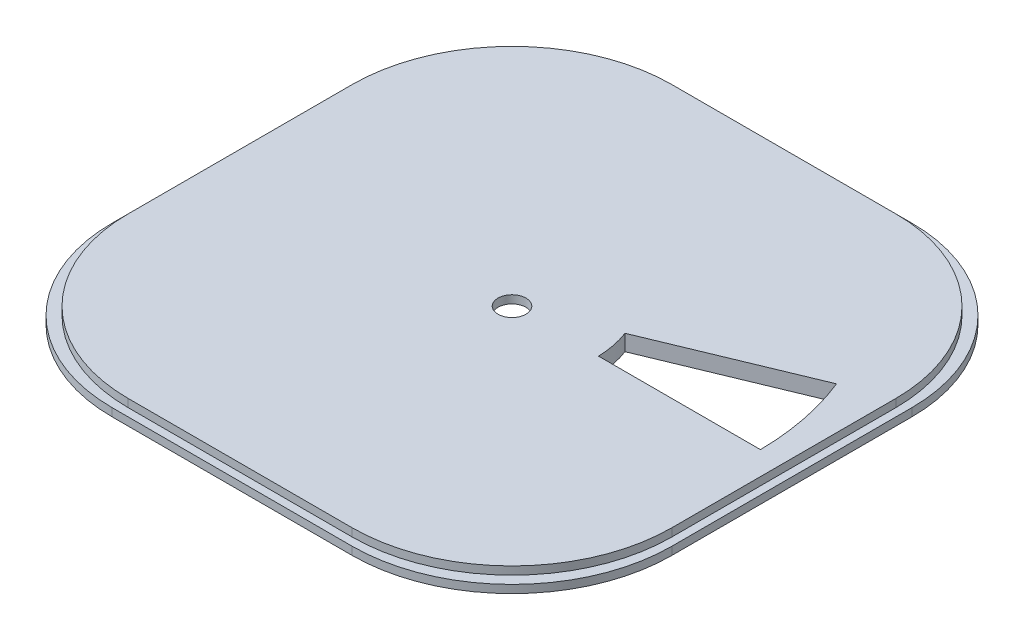
ISO-10303-21;
HEADER;
FILE_DESCRIPTION(('STEP AP214'),'2;1');
FILE_NAME('part.step','',(''),(''),'','','');
FILE_SCHEMA(('AUTOMOTIVE_DESIGN { 1 0 10303 214 1 1 1 1 }'));
ENDSEC;
DATA;
#1=APPLICATION_CONTEXT('core data for automotive mechanical design processes');
#2=APPLICATION_PROTOCOL_DEFINITION('international standard','automotive_design',2000,#1);
#3=PRODUCT_CONTEXT('',#1,'mechanical');
#4=PRODUCT('Part','Part','',(#3));
#5=PRODUCT_RELATED_PRODUCT_CATEGORY('part','',(#4));
#6=PRODUCT_DEFINITION_FORMATION('','',#4);
#7=PRODUCT_DEFINITION_CONTEXT('part definition',#1,'design');
#8=PRODUCT_DEFINITION('design','',#6,#7);
#9=PRODUCT_DEFINITION_SHAPE('','',#8);
#10=(LENGTH_UNIT() NAMED_UNIT(*) SI_UNIT(.MILLI.,.METRE.));
#11=(NAMED_UNIT(*) PLANE_ANGLE_UNIT() SI_UNIT($,.RADIAN.));
#12=(NAMED_UNIT(*) SI_UNIT($,.STERADIAN.) SOLID_ANGLE_UNIT());
#13=UNCERTAINTY_MEASURE_WITH_UNIT(LENGTH_MEASURE(1.E-05),#10,'distance_accuracy_value','');
#14=(GEOMETRIC_REPRESENTATION_CONTEXT(3) GLOBAL_UNCERTAINTY_ASSIGNED_CONTEXT((#13)) GLOBAL_UNIT_ASSIGNED_CONTEXT((#10,
#11,#12)) REPRESENTATION_CONTEXT('',''));
#15=CARTESIAN_POINT('',(0.,0.,0.));
#16=DIRECTION('',(0.,0.,1.));
#17=DIRECTION('',(1.,0.,0.));
#18=AXIS2_PLACEMENT_3D('',#15,#16,#17);
#19=CARTESIAN_POINT('',(-30.,0.,30.));
#20=DIRECTION('',(0.,-1.,0.));
#21=DIRECTION('',(0.,0.,-1.));
#22=AXIS2_PLACEMENT_3D('',#19,#20,#21);
#23=PLANE('',#22);
#24=DIRECTION('',(0.,0.,1.));
#25=VECTOR('',#24,1.);
#26=CARTESIAN_POINT('',(-70.,0.,-29.9999999999997));
#27=LINE('',#26,#25);
#28=CARTESIAN_POINT('',(-70.,0.,-29.9999999999997));
#29=VERTEX_POINT('',#28);
#30=CARTESIAN_POINT('',(-70.,0.,29.9999999999997));
#31=VERTEX_POINT('',#30);
#32=EDGE_CURVE('E323',#29,#31,#27,.T.);
#33=ORIENTED_EDGE('',*,*,#32,.T.);
#34=CARTESIAN_POINT('',(-30.,0.,30.));
#35=DIRECTION('',(0.,-1.,0.));
#36=DIRECTION('',(0.,0.,-1.));
#37=AXIS2_PLACEMENT_3D('',#34,#35,#36);
#38=CIRCLE('',#37,40.);
#39=CARTESIAN_POINT('',(-29.9999999999997,0.,70.));
#40=VERTEX_POINT('',#39);
#41=EDGE_CURVE('E346',#40,#31,#38,.T.);
#42=ORIENTED_EDGE('',*,*,#41,.F.);
#43=DIRECTION('',(1.,0.,0.));
#44=VECTOR('',#43,1.);
#45=CARTESIAN_POINT('',(-29.9999999999997,0.,70.));
#46=LINE('',#45,#44);
#47=CARTESIAN_POINT('',(29.9999999999997,0.,70.));
#48=VERTEX_POINT('',#47);
#49=EDGE_CURVE('E349',#40,#48,#46,.T.);
#50=ORIENTED_EDGE('',*,*,#49,.T.);
#51=CARTESIAN_POINT('',(30.,0.,30.));
#52=DIRECTION('',(0.,1.,0.));
#53=DIRECTION('',(0.,0.,1.));
#54=AXIS2_PLACEMENT_3D('',#51,#52,#53);
#55=CIRCLE('',#54,40.);
#56=CARTESIAN_POINT('',(70.,0.,29.9999999999997));
#57=VERTEX_POINT('',#56);
#58=EDGE_CURVE('E352',#48,#57,#55,.T.);
#59=ORIENTED_EDGE('',*,*,#58,.T.);
#60=DIRECTION('',(0.,0.,1.));
#61=VECTOR('',#60,1.);
#62=CARTESIAN_POINT('',(70.,0.,-29.9999999999997));
#63=LINE('',#62,#61);
#64=CARTESIAN_POINT('',(70.,0.,-29.9999999999997));
#65=VERTEX_POINT('',#64);
#66=EDGE_CURVE('E355',#65,#57,#63,.T.);
#67=ORIENTED_EDGE('',*,*,#66,.F.);
#68=CARTESIAN_POINT('',(30.,0.,-30.));
#69=DIRECTION('',(0.,1.,0.));
#70=DIRECTION('',(0.,0.,1.));
#71=AXIS2_PLACEMENT_3D('',#68,#69,#70);
#72=CIRCLE('',#71,40.);
#73=CARTESIAN_POINT('',(29.9999999999997,0.,-70.));
#74=VERTEX_POINT('',#73);
#75=EDGE_CURVE('E358',#65,#74,#72,.T.);
#76=ORIENTED_EDGE('',*,*,#75,.T.);
#77=DIRECTION('',(1.,0.,0.));
#78=VECTOR('',#77,1.);
#79=CARTESIAN_POINT('',(-29.9999999999997,0.,-70.));
#80=LINE('',#79,#78);
#81=CARTESIAN_POINT('',(-30.,0.,-70.));
#82=VERTEX_POINT('',#81);
#83=EDGE_CURVE('E361',#82,#74,#80,.T.);
#84=ORIENTED_EDGE('',*,*,#83,.F.);
#85=CARTESIAN_POINT('',(-30.,0.,-30.));
#86=DIRECTION('',(0.,-1.,0.));
#87=DIRECTION('',(0.,0.,-1.));
#88=AXIS2_PLACEMENT_3D('',#85,#86,#87);
#89=CIRCLE('',#88,40.);
#90=EDGE_CURVE('E364',#29,#82,#89,.T.);
#91=ORIENTED_EDGE('',*,*,#90,.F.);
#92=EDGE_LOOP('',(#33,#42,#50,#59,#67,#76,#84,#91));
#93=FACE_BOUND('',#92,.T.);
#94=CARTESIAN_POINT('',(-28.,0.,28.));
#95=DIRECTION('',(0.,1.,0.));
#96=DIRECTION('',(0.,0.,1.));
#97=AXIS2_PLACEMENT_3D('',#94,#95,#96);
#98=CIRCLE('',#97,40.);
#99=CARTESIAN_POINT('',(-68.,0.,27.9999999999997));
#100=VERTEX_POINT('',#99);
#101=CARTESIAN_POINT('',(-27.9999999999997,0.,68.));
#102=VERTEX_POINT('',#101);
#103=EDGE_CURVE('E256',#100,#102,#98,.T.);
#104=ORIENTED_EDGE('',*,*,#103,.F.);
#105=DIRECTION('',(0.,0.,1.));
#106=VECTOR('',#105,1.);
#107=CARTESIAN_POINT('',(-68.,0.,-27.9999999999997));
#108=LINE('',#107,#106);
#109=CARTESIAN_POINT('',(-68.,0.,-27.9999999999997));
#110=VERTEX_POINT('',#109);
#111=EDGE_CURVE('E263',#110,#100,#108,.T.);
#112=ORIENTED_EDGE('',*,*,#111,.F.);
#113=CARTESIAN_POINT('',(-28.,0.,-28.));
#114=DIRECTION('',(0.,1.,0.));
#115=DIRECTION('',(0.,0.,-1.));
#116=AXIS2_PLACEMENT_3D('',#113,#114,#115);
#117=CIRCLE('',#116,40.);
#118=CARTESIAN_POINT('',(-28.,0.,-68.));
#119=VERTEX_POINT('',#118);
#120=EDGE_CURVE('E295',#119,#110,#117,.T.);
#121=ORIENTED_EDGE('',*,*,#120,.F.);
#122=DIRECTION('',(-1.,0.,0.));
#123=VECTOR('',#122,1.);
#124=CARTESIAN_POINT('',(-27.9999999999997,0.,-68.));
#125=LINE('',#124,#123);
#126=CARTESIAN_POINT('',(27.9999999999997,0.,-68.));
#127=VERTEX_POINT('',#126);
#128=EDGE_CURVE('E292',#127,#119,#125,.T.);
#129=ORIENTED_EDGE('',*,*,#128,.F.);
#130=CARTESIAN_POINT('',(28.,0.,-28.));
#131=DIRECTION('',(0.,1.,0.));
#132=DIRECTION('',(0.,0.,1.));
#133=AXIS2_PLACEMENT_3D('',#130,#131,#132);
#134=CIRCLE('',#133,40.);
#135=CARTESIAN_POINT('',(68.,0.,-27.9999999999997));
#136=VERTEX_POINT('',#135);
#137=EDGE_CURVE('E289',#136,#127,#134,.T.);
#138=ORIENTED_EDGE('',*,*,#137,.F.);
#139=DIRECTION('',(0.,0.,-1.));
#140=VECTOR('',#139,1.);
#141=CARTESIAN_POINT('',(68.,0.,-27.9999999999997));
#142=LINE('',#141,#140);
#143=CARTESIAN_POINT('',(68.,0.,27.9999999999997));
#144=VERTEX_POINT('',#143);
#145=EDGE_CURVE('E286',#144,#136,#142,.T.);
#146=ORIENTED_EDGE('',*,*,#145,.F.);
#147=CARTESIAN_POINT('',(28.,0.,28.));
#148=DIRECTION('',(0.,1.,0.));
#149=DIRECTION('',(0.,0.,1.));
#150=AXIS2_PLACEMENT_3D('',#147,#148,#149);
#151=CIRCLE('',#150,40.);
#152=CARTESIAN_POINT('',(27.9999999999997,0.,68.));
#153=VERTEX_POINT('',#152);
#154=EDGE_CURVE('E283',#153,#144,#151,.T.);
#155=ORIENTED_EDGE('',*,*,#154,.F.);
#156=DIRECTION('',(1.,0.,0.));
#157=VECTOR('',#156,1.);
#158=CARTESIAN_POINT('',(-27.9999999999997,0.,68.));
#159=LINE('',#158,#157);
#160=EDGE_CURVE('E280',#102,#153,#159,.T.);
#161=ORIENTED_EDGE('',*,*,#160,.F.);
#162=EDGE_LOOP('',(#104,#112,#121,#129,#138,#146,#155,#161));
#163=FACE_BOUND('',#162,.T.);
#164=ADVANCED_FACE('F33',(#93,#163),#23,.F.);
#165=CARTESIAN_POINT('',(-70.,-2.,-29.9999999999997));
#166=DIRECTION('',(-1.,0.,0.));
#167=DIRECTION('',(0.,0.,1.));
#168=AXIS2_PLACEMENT_3D('',#165,#166,#167);
#169=PLANE('',#168);
#170=DIRECTION('',(0.,-1.,0.));
#171=VECTOR('',#170,1.);
#172=CARTESIAN_POINT('',(-70.,-0.999999999999986,3.99999999999999));
#173=LINE('',#172,#171);
#174=CARTESIAN_POINT('',(-70.,-0.999999999999986,3.99999999999999));
#175=VERTEX_POINT('',#174);
#176=CARTESIAN_POINT('',(-70.,-2.,3.99999999999999));
#177=VERTEX_POINT('',#176);
#178=EDGE_CURVE('E236',#175,#177,#173,.T.);
#179=ORIENTED_EDGE('',*,*,#178,.T.);
#180=DIRECTION('',(0.,0.,1.));
#181=VECTOR('',#180,1.);
#182=CARTESIAN_POINT('',(-70.,-2.,-29.9999999999997));
#183=LINE('',#182,#181);
#184=CARTESIAN_POINT('',(-70.,-2.,29.9999999999997));
#185=VERTEX_POINT('',#184);
#186=EDGE_CURVE('E326',#177,#185,#183,.T.);
#187=ORIENTED_EDGE('',*,*,#186,.T.);
#188=DIRECTION('',(0.,1.,0.));
#189=VECTOR('',#188,1.);
#190=CARTESIAN_POINT('',(-70.,-2.,29.9999999999997));
#191=LINE('',#190,#189);
#192=EDGE_CURVE('E37',#185,#31,#191,.T.);
#193=ORIENTED_EDGE('',*,*,#192,.T.);
#194=ORIENTED_EDGE('',*,*,#32,.F.);
#195=DIRECTION('',(0.,1.,0.));
#196=VECTOR('',#195,1.);
#197=CARTESIAN_POINT('',(-70.,-2.,-29.9999999999997));
#198=LINE('',#197,#196);
#199=CARTESIAN_POINT('',(-70.,-2.,-29.9999999999997));
#200=VERTEX_POINT('',#199);
#201=EDGE_CURVE('E11',#200,#29,#198,.T.);
#202=ORIENTED_EDGE('',*,*,#201,.F.);
#203=CARTESIAN_POINT('',(-70.,-2.,-4.00000000000001));
#204=VERTEX_POINT('',#203);
#205=EDGE_CURVE('E214',#200,#204,#183,.T.);
#206=ORIENTED_EDGE('',*,*,#205,.T.);
#207=DIRECTION('',(0.,-1.,0.));
#208=VECTOR('',#207,1.);
#209=CARTESIAN_POINT('',(-70.,-0.999999999999986,-4.00000000000001));
#210=LINE('',#209,#208);
#211=CARTESIAN_POINT('',(-70.,-0.999999999999986,-4.00000000000001));
#212=VERTEX_POINT('',#211);
#213=EDGE_CURVE('E196',#212,#204,#210,.T.);
#214=ORIENTED_EDGE('',*,*,#213,.F.);
#215=DIRECTION('',(0.,0.,-1.));
#216=VECTOR('',#215,1.);
#217=CARTESIAN_POINT('',(-70.,-0.999999999999986,0.));
#218=LINE('',#217,#216);
#219=EDGE_CURVE('E202',#175,#212,#218,.T.);
#220=ORIENTED_EDGE('',*,*,#219,.F.);
#221=EDGE_LOOP('',(#179,#187,#193,#194,#202,#206,#214,#220));
#222=FACE_BOUND('',#221,.T.);
#223=ADVANCED_FACE('F35',(#222),#169,.T.);
#224=CARTESIAN_POINT('',(-30.,-2.,-30.));
#225=DIRECTION('',(0.,1.,0.));
#226=DIRECTION('',(0.,0.,1.));
#227=AXIS2_PLACEMENT_3D('',#224,#225,#226);
#228=CYLINDRICAL_SURFACE('',#227,40.);
#229=ORIENTED_EDGE('',*,*,#90,.T.);
#230=DIRECTION('',(0.,1.,0.));
#231=VECTOR('',#230,1.);
#232=CARTESIAN_POINT('',(-30.,-2.,-70.));
#233=LINE('',#232,#231);
#234=CARTESIAN_POINT('',(-30.,-2.,-70.));
#235=VERTEX_POINT('',#234);
#236=EDGE_CURVE('E42',#235,#82,#233,.T.);
#237=ORIENTED_EDGE('',*,*,#236,.F.);
#238=CARTESIAN_POINT('',(-30.,-2.,-30.));
#239=DIRECTION('',(0.,-1.,0.));
#240=DIRECTION('',(0.,0.,-1.));
#241=AXIS2_PLACEMENT_3D('',#238,#239,#240);
#242=CIRCLE('',#241,40.);
#243=EDGE_CURVE('E342',#200,#235,#242,.T.);
#244=ORIENTED_EDGE('',*,*,#243,.F.);
#245=ORIENTED_EDGE('',*,*,#201,.T.);
#246=EDGE_LOOP('',(#229,#237,#244,#245));
#247=FACE_BOUND('',#246,.T.);
#248=ADVANCED_FACE('F390',(#247),#228,.T.);
#249=CARTESIAN_POINT('',(-29.9999999999997,-2.,-70.));
#250=DIRECTION('',(0.,0.,1.));
#251=DIRECTION('',(1.,0.,0.));
#252=AXIS2_PLACEMENT_3D('',#249,#250,#251);
#253=PLANE('',#252);
#254=ORIENTED_EDGE('',*,*,#83,.T.);
#255=DIRECTION('',(0.,1.,0.));
#256=VECTOR('',#255,1.);
#257=CARTESIAN_POINT('',(29.9999999999997,-2.,-70.));
#258=LINE('',#257,#256);
#259=CARTESIAN_POINT('',(29.9999999999997,-2.,-70.));
#260=VERTEX_POINT('',#259);
#261=EDGE_CURVE('E368',#260,#74,#258,.T.);
#262=ORIENTED_EDGE('',*,*,#261,.F.);
#263=DIRECTION('',(1.,0.,0.));
#264=VECTOR('',#263,1.);
#265=CARTESIAN_POINT('',(-29.9999999999997,-2.,-70.));
#266=LINE('',#265,#264);
#267=EDGE_CURVE('E340',#235,#260,#266,.T.);
#268=ORIENTED_EDGE('',*,*,#267,.F.);
#269=ORIENTED_EDGE('',*,*,#236,.T.);
#270=EDGE_LOOP('',(#254,#262,#268,#269));
#271=FACE_BOUND('',#270,.T.);
#272=ADVANCED_FACE('F394',(#271),#253,.F.);
#273=CARTESIAN_POINT('',(30.,-2.,-30.));
#274=DIRECTION('',(0.,1.,0.));
#275=DIRECTION('',(0.,0.,1.));
#276=AXIS2_PLACEMENT_3D('',#273,#274,#275);
#277=CYLINDRICAL_SURFACE('',#276,40.);
#278=ORIENTED_EDGE('',*,*,#75,.F.);
#279=DIRECTION('',(0.,1.,0.));
#280=VECTOR('',#279,1.);
#281=CARTESIAN_POINT('',(70.,-2.,-29.9999999999997));
#282=LINE('',#281,#280);
#283=CARTESIAN_POINT('',(70.,-2.,-29.9999999999997));
#284=VERTEX_POINT('',#283);
#285=EDGE_CURVE('E370',#284,#65,#282,.T.);
#286=ORIENTED_EDGE('',*,*,#285,.F.);
#287=CARTESIAN_POINT('',(30.,-2.,-30.));
#288=DIRECTION('',(0.,1.,0.));
#289=DIRECTION('',(0.,0.,1.));
#290=AXIS2_PLACEMENT_3D('',#287,#288,#289);
#291=CIRCLE('',#290,40.);
#292=EDGE_CURVE('E337',#284,#260,#291,.T.);
#293=ORIENTED_EDGE('',*,*,#292,.T.);
#294=ORIENTED_EDGE('',*,*,#261,.T.);
#295=EDGE_LOOP('',(#278,#286,#293,#294));
#296=FACE_BOUND('',#295,.T.);
#297=ADVANCED_FACE('F453',(#296),#277,.T.);
#298=CARTESIAN_POINT('',(70.,-2.,-29.9999999999997));
#299=DIRECTION('',(-1.,0.,0.));
#300=DIRECTION('',(0.,0.,1.));
#301=AXIS2_PLACEMENT_3D('',#298,#299,#300);
#302=PLANE('',#301);
#303=ORIENTED_EDGE('',*,*,#66,.T.);
#304=DIRECTION('',(0.,1.,0.));
#305=VECTOR('',#304,1.);
#306=CARTESIAN_POINT('',(70.,-2.,29.9999999999997));
#307=LINE('',#306,#305);
#308=CARTESIAN_POINT('',(70.,-2.,29.9999999999997));
#309=VERTEX_POINT('',#308);
#310=EDGE_CURVE('E372',#309,#57,#307,.T.);
#311=ORIENTED_EDGE('',*,*,#310,.F.);
#312=DIRECTION('',(0.,0.,1.));
#313=VECTOR('',#312,1.);
#314=CARTESIAN_POINT('',(70.,-2.,-29.9999999999997));
#315=LINE('',#314,#313);
#316=EDGE_CURVE('E335',#284,#309,#315,.T.);
#317=ORIENTED_EDGE('',*,*,#316,.F.);
#318=ORIENTED_EDGE('',*,*,#285,.T.);
#319=EDGE_LOOP('',(#303,#311,#317,#318));
#320=FACE_BOUND('',#319,.T.);
#321=ADVANCED_FACE('F456',(#320),#302,.F.);
#322=CARTESIAN_POINT('',(30.,-2.,30.));
#323=DIRECTION('',(0.,1.,0.));
#324=DIRECTION('',(0.,0.,1.));
#325=AXIS2_PLACEMENT_3D('',#322,#323,#324);
#326=CYLINDRICAL_SURFACE('',#325,40.);
#327=ORIENTED_EDGE('',*,*,#58,.F.);
#328=DIRECTION('',(0.,1.,0.));
#329=VECTOR('',#328,1.);
#330=CARTESIAN_POINT('',(29.9999999999997,-2.,70.));
#331=LINE('',#330,#329);
#332=CARTESIAN_POINT('',(29.9999999999997,-2.,70.));
#333=VERTEX_POINT('',#332);
#334=EDGE_CURVE('E374',#333,#48,#331,.T.);
#335=ORIENTED_EDGE('',*,*,#334,.F.);
#336=CARTESIAN_POINT('',(30.,-2.,30.));
#337=DIRECTION('',(0.,1.,0.));
#338=DIRECTION('',(0.,0.,1.));
#339=AXIS2_PLACEMENT_3D('',#336,#337,#338);
#340=CIRCLE('',#339,40.);
#341=EDGE_CURVE('E332',#333,#309,#340,.T.);
#342=ORIENTED_EDGE('',*,*,#341,.T.);
#343=ORIENTED_EDGE('',*,*,#310,.T.);
#344=EDGE_LOOP('',(#327,#335,#342,#343));
#345=FACE_BOUND('',#344,.T.);
#346=ADVANCED_FACE('F460',(#345),#326,.T.);
#347=CARTESIAN_POINT('',(-29.9999999999997,-2.,70.));
#348=DIRECTION('',(0.,0.,1.));
#349=DIRECTION('',(1.,0.,0.));
#350=AXIS2_PLACEMENT_3D('',#347,#348,#349);
#351=PLANE('',#350);
#352=ORIENTED_EDGE('',*,*,#49,.F.);
#353=DIRECTION('',(0.,1.,0.));
#354=VECTOR('',#353,1.);
#355=CARTESIAN_POINT('',(-29.9999999999997,-2.,70.));
#356=LINE('',#355,#354);
#357=CARTESIAN_POINT('',(-29.9999999999997,-2.,70.));
#358=VERTEX_POINT('',#357);
#359=EDGE_CURVE('E375',#358,#40,#356,.T.);
#360=ORIENTED_EDGE('',*,*,#359,.F.);
#361=DIRECTION('',(1.,0.,0.));
#362=VECTOR('',#361,1.);
#363=CARTESIAN_POINT('',(-29.9999999999997,-2.,70.));
#364=LINE('',#363,#362);
#365=EDGE_CURVE('E329',#358,#333,#364,.T.);
#366=ORIENTED_EDGE('',*,*,#365,.T.);
#367=ORIENTED_EDGE('',*,*,#334,.T.);
#368=EDGE_LOOP('',(#352,#360,#366,#367));
#369=FACE_BOUND('',#368,.T.);
#370=ADVANCED_FACE('F464',(#369),#351,.T.);
#371=CARTESIAN_POINT('',(-30.,-2.,30.));
#372=DIRECTION('',(0.,1.,0.));
#373=DIRECTION('',(0.,0.,1.));
#374=AXIS2_PLACEMENT_3D('',#371,#372,#373);
#375=CYLINDRICAL_SURFACE('',#374,40.);
#376=ORIENTED_EDGE('',*,*,#41,.T.);
#377=ORIENTED_EDGE('',*,*,#192,.F.);
#378=CARTESIAN_POINT('',(-30.,-2.,30.));
#379=DIRECTION('',(0.,-1.,0.));
#380=DIRECTION('',(0.,0.,-1.));
#381=AXIS2_PLACEMENT_3D('',#378,#379,#380);
#382=CIRCLE('',#381,40.);
#383=EDGE_CURVE('E325',#358,#185,#382,.T.);
#384=ORIENTED_EDGE('',*,*,#383,.F.);
#385=ORIENTED_EDGE('',*,*,#359,.T.);
#386=EDGE_LOOP('',(#376,#377,#384,#385));
#387=FACE_BOUND('',#386,.T.);
#388=ADVANCED_FACE('F382',(#387),#375,.T.);
#389=CARTESIAN_POINT('',(-30.,-2.,30.));
#390=DIRECTION('',(0.,-1.,0.));
#391=DIRECTION('',(0.,0.,-1.));
#392=AXIS2_PLACEMENT_3D('',#389,#390,#391);
#393=PLANE('',#392);
#394=DIRECTION('',(-1.,0.,0.));
#395=VECTOR('',#394,1.);
#396=CARTESIAN_POINT('',(-70.,-2.,3.99999999999999));
#397=LINE('',#396,#395);
#398=CARTESIAN_POINT('',(-10.2469507659596,-2.,3.99999999999999));
#399=VERTEX_POINT('',#398);
#400=EDGE_CURVE('E210',#399,#177,#397,.T.);
#401=ORIENTED_EDGE('',*,*,#400,.F.);
#402=CARTESIAN_POINT('',(0.,-2.,0.));
#403=DIRECTION('',(0.,-1.,0.));
#404=DIRECTION('',(0.,0.,-1.));
#405=AXIS2_PLACEMENT_3D('',#402,#403,#404);
#406=CIRCLE('',#405,11.);
#407=CARTESIAN_POINT('',(-10.2469507659596,-2.,-4.00000000000001));
#408=VERTEX_POINT('',#407);
#409=EDGE_CURVE('E246',#408,#399,#406,.T.);
#410=ORIENTED_EDGE('',*,*,#409,.F.);
#411=DIRECTION('',(1.,0.,0.));
#412=VECTOR('',#411,1.);
#413=CARTESIAN_POINT('',(-70.,-2.,-4.00000000000001));
#414=LINE('',#413,#412);
#415=EDGE_CURVE('E402',#204,#408,#414,.T.);
#416=ORIENTED_EDGE('',*,*,#415,.F.);
#417=ORIENTED_EDGE('',*,*,#205,.F.);
#418=ORIENTED_EDGE('',*,*,#243,.T.);
#419=ORIENTED_EDGE('',*,*,#267,.T.);
#420=ORIENTED_EDGE('',*,*,#292,.F.);
#421=ORIENTED_EDGE('',*,*,#316,.T.);
#422=ORIENTED_EDGE('',*,*,#341,.F.);
#423=ORIENTED_EDGE('',*,*,#365,.F.);
#424=ORIENTED_EDGE('',*,*,#383,.T.);
#425=ORIENTED_EDGE('',*,*,#186,.F.);
#426=EDGE_LOOP('',(#401,#410,#416,#417,#418,#419,#420,#421,#422,#423,#424,#425));
#427=FACE_BOUND('',#426,.T.);
#428=CARTESIAN_POINT('',(-3.34383897184799,-2.,0.67943395435353));
#429=DIRECTION('',(0.,-1.,0.));
#430=DIRECTION('',(0.,0.,1.));
#431=AXIS2_PLACEMENT_3D('',#428,#429,#430);
#432=CIRCLE('',#431,25.);
#433=CARTESIAN_POINT('',(20.0028952371791,-2.,-8.2609240794752));
#434=VERTEX_POINT('',#433);
#435=CARTESIAN_POINT('',(21.6470578138116,-2.,0.00483937350486546));
#436=VERTEX_POINT('',#435);
#437=EDGE_CURVE('E221',#434,#436,#432,.T.);
#438=ORIENTED_EDGE('',*,*,#437,.T.);
#439=DIRECTION('',(1.,0.,0.));
#440=VECTOR('',#439,1.);
#441=CARTESIAN_POINT('',(21.6470578138116,-2.,0.00483937350486546));
#442=LINE('',#441,#440);
#443=CARTESIAN_POINT('',(62.1526870593202,-2.,0.00483937350486546));
#444=VERTEX_POINT('',#443);
#445=EDGE_CURVE('E224',#436,#444,#442,.T.);
#446=ORIENTED_EDGE('',*,*,#445,.T.);
#447=CARTESIAN_POINT('',(-3.34383897184799,-2.,0.67943395435353));
#448=DIRECTION('',(0.,1.,0.));
#449=DIRECTION('',(0.,0.,1.));
#450=AXIS2_PLACEMENT_3D('',#447,#448,#449);
#451=CIRCLE('',#450,65.5);
#452=CARTESIAN_POINT('',(57.4252170485951,-2.,-23.7617573092542));
#453=VERTEX_POINT('',#452);
#454=EDGE_CURVE('E58',#444,#453,#451,.T.);
#455=ORIENTED_EDGE('',*,*,#454,.T.);
#456=DIRECTION('',(-0.923879532511287,0.,0.38268343236509));
#457=VECTOR('',#456,1.);
#458=CARTESIAN_POINT('',(20.0028952371791,-2.,-8.2609240794752));
#459=LINE('',#458,#457);
#460=EDGE_CURVE('E229',#453,#434,#459,.T.);
#461=ORIENTED_EDGE('',*,*,#460,.T.);
#462=EDGE_LOOP('',(#438,#446,#455,#461));
#463=FACE_BOUND('',#462,.T.);
#464=ADVANCED_FACE('F399',(#427,#463),#393,.T.);
#465=CARTESIAN_POINT('',(-28.,2.,28.));
#466=DIRECTION('',(0.,-1.,0.));
#467=DIRECTION('',(0.,0.,-1.));
#468=AXIS2_PLACEMENT_3D('',#465,#466,#467);
#469=CYLINDRICAL_SURFACE('',#468,40.);
#470=ORIENTED_EDGE('',*,*,#103,.T.);
#471=DIRECTION('',(0.,-1.,0.));
#472=VECTOR('',#471,1.);
#473=CARTESIAN_POINT('',(-27.9999999999997,2.,68.));
#474=LINE('',#473,#472);
#475=CARTESIAN_POINT('',(-27.9999999999997,2.,68.));
#476=VERTEX_POINT('',#475);
#477=EDGE_CURVE('E320',#476,#102,#474,.T.);
#478=ORIENTED_EDGE('',*,*,#477,.F.);
#479=CARTESIAN_POINT('',(-28.,2.,28.));
#480=DIRECTION('',(0.,1.,0.));
#481=DIRECTION('',(0.,0.,1.));
#482=AXIS2_PLACEMENT_3D('',#479,#480,#481);
#483=CIRCLE('',#482,40.);
#484=CARTESIAN_POINT('',(-68.,2.,27.9999999999997));
#485=VERTEX_POINT('',#484);
#486=EDGE_CURVE('E259',#485,#476,#483,.T.);
#487=ORIENTED_EDGE('',*,*,#486,.F.);
#488=DIRECTION('',(0.,-1.,0.));
#489=VECTOR('',#488,1.);
#490=CARTESIAN_POINT('',(-68.,2.,27.9999999999997));
#491=LINE('',#490,#489);
#492=EDGE_CURVE('E277',#485,#100,#491,.T.);
#493=ORIENTED_EDGE('',*,*,#492,.T.);
#494=EDGE_LOOP('',(#470,#478,#487,#493));
#495=FACE_BOUND('',#494,.T.);
#496=ADVANCED_FACE('F473',(#495),#469,.T.);
#497=CARTESIAN_POINT('',(-27.9999999999997,2.,68.));
#498=DIRECTION('',(0.,0.,-1.));
#499=DIRECTION('',(-1.,0.,0.));
#500=AXIS2_PLACEMENT_3D('',#497,#498,#499);
#501=PLANE('',#500);
#502=ORIENTED_EDGE('',*,*,#160,.T.);
#503=DIRECTION('',(0.,-1.,0.));
#504=VECTOR('',#503,1.);
#505=CARTESIAN_POINT('',(27.9999999999997,2.,68.));
#506=LINE('',#505,#504);
#507=CARTESIAN_POINT('',(27.9999999999997,2.,68.));
#508=VERTEX_POINT('',#507);
#509=EDGE_CURVE('E317',#508,#153,#506,.T.);
#510=ORIENTED_EDGE('',*,*,#509,.F.);
#511=DIRECTION('',(1.,0.,0.));
#512=VECTOR('',#511,1.);
#513=CARTESIAN_POINT('',(-27.9999999999997,2.,68.));
#514=LINE('',#513,#512);
#515=EDGE_CURVE('E262',#476,#508,#514,.T.);
#516=ORIENTED_EDGE('',*,*,#515,.F.);
#517=ORIENTED_EDGE('',*,*,#477,.T.);
#518=EDGE_LOOP('',(#502,#510,#516,#517));
#519=FACE_BOUND('',#518,.T.);
#520=ADVANCED_FACE('F477',(#519),#501,.F.);
#521=CARTESIAN_POINT('',(28.,2.,28.));
#522=DIRECTION('',(0.,-1.,0.));
#523=DIRECTION('',(0.,0.,-1.));
#524=AXIS2_PLACEMENT_3D('',#521,#522,#523);
#525=CYLINDRICAL_SURFACE('',#524,40.);
#526=ORIENTED_EDGE('',*,*,#154,.T.);
#527=DIRECTION('',(0.,-1.,0.));
#528=VECTOR('',#527,1.);
#529=CARTESIAN_POINT('',(68.,2.,27.9999999999997));
#530=LINE('',#529,#528);
#531=CARTESIAN_POINT('',(68.,2.,27.9999999999997));
#532=VERTEX_POINT('',#531);
#533=EDGE_CURVE('E314',#532,#144,#530,.T.);
#534=ORIENTED_EDGE('',*,*,#533,.F.);
#535=CARTESIAN_POINT('',(28.,2.,28.));
#536=DIRECTION('',(0.,1.,0.));
#537=DIRECTION('',(0.,0.,1.));
#538=AXIS2_PLACEMENT_3D('',#535,#536,#537);
#539=CIRCLE('',#538,40.);
#540=EDGE_CURVE('E265',#508,#532,#539,.T.);
#541=ORIENTED_EDGE('',*,*,#540,.F.);
#542=ORIENTED_EDGE('',*,*,#509,.T.);
#543=EDGE_LOOP('',(#526,#534,#541,#542));
#544=FACE_BOUND('',#543,.T.);
#545=ADVANCED_FACE('F482',(#544),#525,.T.);
#546=CARTESIAN_POINT('',(68.,2.,-27.9999999999997));
#547=DIRECTION('',(-1.,0.,0.));
#548=DIRECTION('',(0.,0.,1.));
#549=AXIS2_PLACEMENT_3D('',#546,#547,#548);
#550=PLANE('',#549);
#551=ORIENTED_EDGE('',*,*,#145,.T.);
#552=DIRECTION('',(0.,-1.,0.));
#553=VECTOR('',#552,1.);
#554=CARTESIAN_POINT('',(68.,2.,-27.9999999999997));
#555=LINE('',#554,#553);
#556=CARTESIAN_POINT('',(68.,2.,-27.9999999999997));
#557=VERTEX_POINT('',#556);
#558=EDGE_CURVE('E311',#557,#136,#555,.T.);
#559=ORIENTED_EDGE('',*,*,#558,.F.);
#560=DIRECTION('',(0.,0.,-1.));
#561=VECTOR('',#560,1.);
#562=CARTESIAN_POINT('',(68.,2.,-27.9999999999997));
#563=LINE('',#562,#561);
#564=EDGE_CURVE('E267',#532,#557,#563,.T.);
#565=ORIENTED_EDGE('',*,*,#564,.F.);
#566=ORIENTED_EDGE('',*,*,#533,.T.);
#567=EDGE_LOOP('',(#551,#559,#565,#566));
#568=FACE_BOUND('',#567,.T.);
#569=ADVANCED_FACE('F488',(#568),#550,.F.);
#570=CARTESIAN_POINT('',(28.,2.,-28.));
#571=DIRECTION('',(0.,-1.,0.));
#572=DIRECTION('',(0.,0.,-1.));
#573=AXIS2_PLACEMENT_3D('',#570,#571,#572);
#574=CYLINDRICAL_SURFACE('',#573,40.);
#575=ORIENTED_EDGE('',*,*,#137,.T.);
#576=DIRECTION('',(0.,-1.,0.));
#577=VECTOR('',#576,1.);
#578=CARTESIAN_POINT('',(27.9999999999997,2.,-68.));
#579=LINE('',#578,#577);
#580=CARTESIAN_POINT('',(27.9999999999997,2.,-68.));
#581=VERTEX_POINT('',#580);
#582=EDGE_CURVE('E308',#581,#127,#579,.T.);
#583=ORIENTED_EDGE('',*,*,#582,.F.);
#584=CARTESIAN_POINT('',(28.,2.,-28.));
#585=DIRECTION('',(0.,1.,0.));
#586=DIRECTION('',(0.,0.,1.));
#587=AXIS2_PLACEMENT_3D('',#584,#585,#586);
#588=CIRCLE('',#587,40.);
#589=EDGE_CURVE('E269',#557,#581,#588,.T.);
#590=ORIENTED_EDGE('',*,*,#589,.F.);
#591=ORIENTED_EDGE('',*,*,#558,.T.);
#592=EDGE_LOOP('',(#575,#583,#590,#591));
#593=FACE_BOUND('',#592,.T.);
#594=ADVANCED_FACE('F492',(#593),#574,.T.);
#595=CARTESIAN_POINT('',(-27.9999999999997,2.,-68.));
#596=DIRECTION('',(0.,0.,1.));
#597=DIRECTION('',(1.,0.,0.));
#598=AXIS2_PLACEMENT_3D('',#595,#596,#597);
#599=PLANE('',#598);
#600=ORIENTED_EDGE('',*,*,#128,.T.);
#601=DIRECTION('',(0.,-1.,0.));
#602=VECTOR('',#601,1.);
#603=CARTESIAN_POINT('',(-28.,2.,-68.));
#604=LINE('',#603,#602);
#605=CARTESIAN_POINT('',(-28.,2.,-68.));
#606=VERTEX_POINT('',#605);
#607=EDGE_CURVE('E305',#606,#119,#604,.T.);
#608=ORIENTED_EDGE('',*,*,#607,.F.);
#609=DIRECTION('',(-1.,0.,0.));
#610=VECTOR('',#609,1.);
#611=CARTESIAN_POINT('',(-27.9999999999997,2.,-68.));
#612=LINE('',#611,#610);
#613=EDGE_CURVE('E271',#581,#606,#612,.T.);
#614=ORIENTED_EDGE('',*,*,#613,.F.);
#615=ORIENTED_EDGE('',*,*,#582,.T.);
#616=EDGE_LOOP('',(#600,#608,#614,#615));
#617=FACE_BOUND('',#616,.T.);
#618=ADVANCED_FACE('F496',(#617),#599,.F.);
#619=CARTESIAN_POINT('',(-28.,2.,-28.));
#620=DIRECTION('',(0.,-1.,0.));
#621=DIRECTION('',(0.,0.,-1.));
#622=AXIS2_PLACEMENT_3D('',#619,#620,#621);
#623=CYLINDRICAL_SURFACE('',#622,40.);
#624=ORIENTED_EDGE('',*,*,#120,.T.);
#625=DIRECTION('',(0.,-1.,0.));
#626=VECTOR('',#625,1.);
#627=CARTESIAN_POINT('',(-68.,2.,-27.9999999999997));
#628=LINE('',#627,#626);
#629=CARTESIAN_POINT('',(-68.,2.,-27.9999999999997));
#630=VERTEX_POINT('',#629);
#631=EDGE_CURVE('E302',#630,#110,#628,.T.);
#632=ORIENTED_EDGE('',*,*,#631,.F.);
#633=CARTESIAN_POINT('',(-28.,2.,-28.));
#634=DIRECTION('',(0.,1.,0.));
#635=DIRECTION('',(0.,0.,-1.));
#636=AXIS2_PLACEMENT_3D('',#633,#634,#635);
#637=CIRCLE('',#636,40.);
#638=EDGE_CURVE('E273',#606,#630,#637,.T.);
#639=ORIENTED_EDGE('',*,*,#638,.F.);
#640=ORIENTED_EDGE('',*,*,#607,.T.);
#641=EDGE_LOOP('',(#624,#632,#639,#640));
#642=FACE_BOUND('',#641,.T.);
#643=ADVANCED_FACE('F500',(#642),#623,.T.);
#644=CARTESIAN_POINT('',(-68.,2.,-27.9999999999997));
#645=DIRECTION('',(1.,0.,0.));
#646=DIRECTION('',(0.,0.,-1.));
#647=AXIS2_PLACEMENT_3D('',#644,#645,#646);
#648=PLANE('',#647);
#649=ORIENTED_EDGE('',*,*,#111,.T.);
#650=ORIENTED_EDGE('',*,*,#492,.F.);
#651=DIRECTION('',(0.,0.,1.));
#652=VECTOR('',#651,1.);
#653=CARTESIAN_POINT('',(-68.,2.,-27.9999999999997));
#654=LINE('',#653,#652);
#655=EDGE_CURVE('E275',#630,#485,#654,.T.);
#656=ORIENTED_EDGE('',*,*,#655,.F.);
#657=ORIENTED_EDGE('',*,*,#631,.T.);
#658=EDGE_LOOP('',(#649,#650,#656,#657));
#659=FACE_BOUND('',#658,.T.);
#660=ADVANCED_FACE('F437',(#659),#648,.F.);
#661=CARTESIAN_POINT('',(-28.,2.,28.));
#662=DIRECTION('',(0.,1.,0.));
#663=DIRECTION('',(0.,0.,1.));
#664=AXIS2_PLACEMENT_3D('',#661,#662,#663);
#665=PLANE('',#664);
#666=CARTESIAN_POINT('',(0.,2.,0.));
#667=DIRECTION('',(0.,1.,0.));
#668=DIRECTION('',(0.,0.,1.));
#669=AXIS2_PLACEMENT_3D('',#666,#667,#668);
#670=CIRCLE('',#669,3.5);
#671=CARTESIAN_POINT('',(0.,2.,3.5));
#672=VERTEX_POINT('',#671);
#673=EDGE_CURVE('E403',#672,#672,#670,.T.);
#674=ORIENTED_EDGE('',*,*,#673,.F.);
#675=EDGE_LOOP('',(#674));
#676=FACE_BOUND('',#675,.T.);
#677=CARTESIAN_POINT('',(-3.34383897184799,2.,0.67943395435353));
#678=DIRECTION('',(0.,-1.,0.));
#679=DIRECTION('',(0.,0.,1.));
#680=AXIS2_PLACEMENT_3D('',#677,#678,#679);
#681=CIRCLE('',#680,25.);
#682=CARTESIAN_POINT('',(20.0028952371791,2.,-8.2609240794752));
#683=VERTEX_POINT('',#682);
#684=CARTESIAN_POINT('',(21.6470578138116,2.,0.00483937350486546));
#685=VERTEX_POINT('',#684);
#686=EDGE_CURVE('E233',#683,#685,#681,.T.);
#687=ORIENTED_EDGE('',*,*,#686,.F.);
#688=DIRECTION('',(-0.923879532511287,0.,0.38268343236509));
#689=VECTOR('',#688,1.);
#690=CARTESIAN_POINT('',(20.0028952371791,2.,-8.2609240794752));
#691=LINE('',#690,#689);
#692=CARTESIAN_POINT('',(57.4252170485951,2.,-23.7617573092542));
#693=VERTEX_POINT('',#692);
#694=EDGE_CURVE('E225',#693,#683,#691,.T.);
#695=ORIENTED_EDGE('',*,*,#694,.F.);
#696=CARTESIAN_POINT('',(-3.34383897184799,2.,0.67943395435353));
#697=DIRECTION('',(0.,1.,0.));
#698=DIRECTION('',(0.,0.,1.));
#699=AXIS2_PLACEMENT_3D('',#696,#697,#698);
#700=CIRCLE('',#699,65.5);
#701=CARTESIAN_POINT('',(62.1526870593202,2.,0.00483937350485939));
#702=VERTEX_POINT('',#701);
#703=EDGE_CURVE('E239',#702,#693,#700,.T.);
#704=ORIENTED_EDGE('',*,*,#703,.F.);
#705=DIRECTION('',(1.,0.,0.));
#706=VECTOR('',#705,1.);
#707=CARTESIAN_POINT('',(21.6470578138116,2.,0.00483937350486546));
#708=LINE('',#707,#706);
#709=EDGE_CURVE('E235',#685,#702,#708,.T.);
#710=ORIENTED_EDGE('',*,*,#709,.F.);
#711=EDGE_LOOP('',(#687,#695,#704,#710));
#712=FACE_BOUND('',#711,.T.);
#713=ORIENTED_EDGE('',*,*,#486,.T.);
#714=ORIENTED_EDGE('',*,*,#515,.T.);
#715=ORIENTED_EDGE('',*,*,#540,.T.);
#716=ORIENTED_EDGE('',*,*,#564,.T.);
#717=ORIENTED_EDGE('',*,*,#589,.T.);
#718=ORIENTED_EDGE('',*,*,#613,.T.);
#719=ORIENTED_EDGE('',*,*,#638,.T.);
#720=ORIENTED_EDGE('',*,*,#655,.T.);
#721=EDGE_LOOP('',(#713,#714,#715,#716,#717,#718,#719,#720));
#722=FACE_BOUND('',#721,.T.);
#723=ADVANCED_FACE('F430',(#676,#712,#722),#665,.T.);
#724=CARTESIAN_POINT('',(0.,0.,0.));
#725=DIRECTION('',(0.,-1.,0.));
#726=DIRECTION('',(0.,0.,-1.));
#727=AXIS2_PLACEMENT_3D('',#724,#725,#726);
#728=CYLINDRICAL_SURFACE('',#727,11.);
#729=ORIENTED_EDGE('',*,*,#409,.T.);
#730=DIRECTION('',(0.,-1.,0.));
#731=VECTOR('',#730,1.);
#732=CARTESIAN_POINT('',(-10.2469507659596,-0.999999999999986,3.99999999999999));
#733=LINE('',#732,#731);
#734=CARTESIAN_POINT('',(-10.2469507659596,-0.999999999999986,3.99999999999999));
#735=VERTEX_POINT('',#734);
#736=EDGE_CURVE('E216',#735,#399,#733,.T.);
#737=ORIENTED_EDGE('',*,*,#736,.F.);
#738=CARTESIAN_POINT('',(0.,-0.999999999999986,0.));
#739=DIRECTION('',(0.,1.,0.));
#740=DIRECTION('',(0.,0.,-1.));
#741=AXIS2_PLACEMENT_3D('',#738,#739,#740);
#742=CIRCLE('',#741,11.);
#743=CARTESIAN_POINT('',(-10.2469507659596,-0.999999999999986,-4.00000000000001));
#744=VERTEX_POINT('',#743);
#745=EDGE_CURVE('E201',#744,#735,#742,.T.);
#746=ORIENTED_EDGE('',*,*,#745,.F.);
#747=DIRECTION('',(0.,-1.,0.));
#748=VECTOR('',#747,1.);
#749=CARTESIAN_POINT('',(-10.2469507659596,-0.999999999999986,-4.00000000000001));
#750=LINE('',#749,#748);
#751=EDGE_CURVE('E199',#744,#408,#750,.T.);
#752=ORIENTED_EDGE('',*,*,#751,.T.);
#753=EDGE_LOOP('',(#729,#737,#746,#752));
#754=FACE_BOUND('',#753,.T.);
#755=CARTESIAN_POINT('',(0.,0.,0.));
#756=DIRECTION('',(0.,-1.,0.));
#757=DIRECTION('',(0.,0.,-1.));
#758=AXIS2_PLACEMENT_3D('',#755,#756,#757);
#759=CIRCLE('',#758,11.);
#760=CARTESIAN_POINT('',(0.,0.,-11.));
#761=VERTEX_POINT('',#760);
#762=EDGE_CURVE('E253',#761,#761,#759,.T.);
#763=ORIENTED_EDGE('',*,*,#762,.F.);
#764=EDGE_LOOP('',(#763));
#765=FACE_BOUND('',#764,.T.);
#766=ADVANCED_FACE('F415',(#754,#765),#728,.F.);
#767=CARTESIAN_POINT('',(0.,0.,0.));
#768=DIRECTION('',(0.,-1.,0.));
#769=DIRECTION('',(0.,0.,-1.));
#770=AXIS2_PLACEMENT_3D('',#767,#768,#769);
#771=PLANE('',#770);
#772=CARTESIAN_POINT('',(0.,0.,0.));
#773=DIRECTION('',(0.,-1.,0.));
#774=DIRECTION('',(0.,0.,-1.));
#775=AXIS2_PLACEMENT_3D('',#772,#773,#774);
#776=CIRCLE('',#775,3.5);
#777=CARTESIAN_POINT('',(0.,0.,-3.5));
#778=VERTEX_POINT('',#777);
#779=EDGE_CURVE('E407',#778,#778,#776,.T.);
#780=ORIENTED_EDGE('',*,*,#779,.F.);
#781=EDGE_LOOP('',(#780));
#782=FACE_BOUND('',#781,.T.);
#783=ORIENTED_EDGE('',*,*,#762,.T.);
#784=EDGE_LOOP('',(#783));
#785=FACE_BOUND('',#784,.T.);
#786=ADVANCED_FACE('F423',(#782,#785),#771,.T.);
#787=CARTESIAN_POINT('',(-3.34383897184799,-2.,0.67943395435353));
#788=DIRECTION('',(0.,1.,0.));
#789=DIRECTION('',(0.,0.,1.));
#790=AXIS2_PLACEMENT_3D('',#787,#788,#789);
#791=CYLINDRICAL_SURFACE('',#790,25.);
#792=ORIENTED_EDGE('',*,*,#686,.T.);
#793=DIRECTION('',(0.,1.,0.));
#794=VECTOR('',#793,1.);
#795=CARTESIAN_POINT('',(21.6470578138116,-2.,0.00483937350486546));
#796=LINE('',#795,#794);
#797=EDGE_CURVE('E232',#436,#685,#796,.T.);
#798=ORIENTED_EDGE('',*,*,#797,.F.);
#799=ORIENTED_EDGE('',*,*,#437,.F.);
#800=DIRECTION('',(0.,1.,0.));
#801=VECTOR('',#800,1.);
#802=CARTESIAN_POINT('',(20.0028952371791,-2.,-8.2609240794752));
#803=LINE('',#802,#801);
#804=EDGE_CURVE('E244',#434,#683,#803,.T.);
#805=ORIENTED_EDGE('',*,*,#804,.T.);
#806=EDGE_LOOP('',(#792,#798,#799,#805));
#807=FACE_BOUND('',#806,.T.);
#808=ADVANCED_FACE('F426',(#807),#791,.T.);
#809=CARTESIAN_POINT('',(20.0028952371791,-2.,-8.2609240794752));
#810=DIRECTION('',(-0.38268343236509,0.,-0.923879532511287));
#811=DIRECTION('',(-0.923879532511287,0.,0.38268343236509));
#812=AXIS2_PLACEMENT_3D('',#809,#810,#811);
#813=PLANE('',#812);
#814=ORIENTED_EDGE('',*,*,#694,.T.);
#815=ORIENTED_EDGE('',*,*,#804,.F.);
#816=ORIENTED_EDGE('',*,*,#460,.F.);
#817=DIRECTION('',(0.,1.,0.));
#818=VECTOR('',#817,1.);
#819=CARTESIAN_POINT('',(57.4252170485951,-2.,-23.7617573092542));
#820=LINE('',#819,#818);
#821=EDGE_CURVE('E247',#453,#693,#820,.T.);
#822=ORIENTED_EDGE('',*,*,#821,.T.);
#823=EDGE_LOOP('',(#814,#815,#816,#822));
#824=FACE_BOUND('',#823,.T.);
#825=ADVANCED_FACE('F552',(#824),#813,.F.);
#826=CARTESIAN_POINT('',(-3.34383897184799,-2.,0.67943395435353));
#827=DIRECTION('',(0.,1.,0.));
#828=DIRECTION('',(0.,0.,1.));
#829=AXIS2_PLACEMENT_3D('',#826,#827,#828);
#830=CYLINDRICAL_SURFACE('',#829,65.5);
#831=ORIENTED_EDGE('',*,*,#703,.T.);
#832=ORIENTED_EDGE('',*,*,#821,.F.);
#833=ORIENTED_EDGE('',*,*,#454,.F.);
#834=DIRECTION('',(0.,1.,0.));
#835=VECTOR('',#834,1.);
#836=CARTESIAN_POINT('',(62.1526870593202,-2.,0.00483937350485939));
#837=LINE('',#836,#835);
#838=EDGE_CURVE('E249',#444,#702,#837,.T.);
#839=ORIENTED_EDGE('',*,*,#838,.T.);
#840=EDGE_LOOP('',(#831,#832,#833,#839));
#841=FACE_BOUND('',#840,.T.);
#842=ADVANCED_FACE('F559',(#841),#830,.F.);
#843=CARTESIAN_POINT('',(21.6470578138116,-2.,0.00483937350486546));
#844=DIRECTION('',(0.,0.,1.));
#845=DIRECTION('',(1.,0.,0.));
#846=AXIS2_PLACEMENT_3D('',#843,#844,#845);
#847=PLANE('',#846);
#848=ORIENTED_EDGE('',*,*,#709,.T.);
#849=ORIENTED_EDGE('',*,*,#838,.F.);
#850=ORIENTED_EDGE('',*,*,#445,.F.);
#851=ORIENTED_EDGE('',*,*,#797,.T.);
#852=EDGE_LOOP('',(#848,#849,#850,#851));
#853=FACE_BOUND('',#852,.T.);
#854=ADVANCED_FACE('F566',(#853),#847,.F.);
#855=CARTESIAN_POINT('',(-70.,-0.999999999999986,3.99999999999999));
#856=DIRECTION('',(0.,0.,1.));
#857=DIRECTION('',(1.,0.,0.));
#858=AXIS2_PLACEMENT_3D('',#855,#856,#857);
#859=PLANE('',#858);
#860=ORIENTED_EDGE('',*,*,#400,.T.);
#861=ORIENTED_EDGE('',*,*,#178,.F.);
#862=DIRECTION('',(-1.,0.,0.));
#863=VECTOR('',#862,1.);
#864=CARTESIAN_POINT('',(-70.,-0.999999999999986,3.99999999999999));
#865=LINE('',#864,#863);
#866=EDGE_CURVE('E207',#735,#175,#865,.T.);
#867=ORIENTED_EDGE('',*,*,#866,.F.);
#868=ORIENTED_EDGE('',*,*,#736,.T.);
#869=EDGE_LOOP('',(#860,#861,#867,#868));
#870=FACE_BOUND('',#869,.T.);
#871=ADVANCED_FACE('F413',(#870),#859,.F.);
#872=CARTESIAN_POINT('',(-70.,-0.999999999999986,-4.00000000000001));
#873=DIRECTION('',(0.,0.,-1.));
#874=DIRECTION('',(-1.,0.,0.));
#875=AXIS2_PLACEMENT_3D('',#872,#873,#874);
#876=PLANE('',#875);
#877=ORIENTED_EDGE('',*,*,#415,.T.);
#878=ORIENTED_EDGE('',*,*,#751,.F.);
#879=DIRECTION('',(1.,0.,0.));
#880=VECTOR('',#879,1.);
#881=CARTESIAN_POINT('',(-70.,-0.999999999999986,-4.00000000000001));
#882=LINE('',#881,#880);
#883=EDGE_CURVE('E50',#212,#744,#882,.T.);
#884=ORIENTED_EDGE('',*,*,#883,.F.);
#885=ORIENTED_EDGE('',*,*,#213,.T.);
#886=EDGE_LOOP('',(#877,#878,#884,#885));
#887=FACE_BOUND('',#886,.T.);
#888=ADVANCED_FACE('F194',(#887),#876,.F.);
#889=CARTESIAN_POINT('',(0.,-0.999999999999986,0.));
#890=DIRECTION('',(0.,-1.,0.));
#891=DIRECTION('',(0.,0.,-1.));
#892=AXIS2_PLACEMENT_3D('',#889,#890,#891);
#893=PLANE('',#892);
#894=ORIENTED_EDGE('',*,*,#219,.T.);
#895=ORIENTED_EDGE('',*,*,#883,.T.);
#896=ORIENTED_EDGE('',*,*,#745,.T.);
#897=ORIENTED_EDGE('',*,*,#866,.T.);
#898=EDGE_LOOP('',(#894,#895,#896,#897));
#899=FACE_BOUND('',#898,.T.);
#900=ADVANCED_FACE('F206',(#899),#893,.T.);
#901=CARTESIAN_POINT('',(0.,10.,0.));
#902=DIRECTION('',(0.,-1.,0.));
#903=DIRECTION('',(0.,0.,-1.));
#904=AXIS2_PLACEMENT_3D('',#901,#902,#903);
#905=CYLINDRICAL_SURFACE('',#904,3.5);
#906=ORIENTED_EDGE('',*,*,#673,.T.);
#907=EDGE_LOOP('',(#906));
#908=FACE_BOUND('',#907,.T.);
#909=ORIENTED_EDGE('',*,*,#779,.T.);
#910=EDGE_LOOP('',(#909));
#911=FACE_BOUND('',#910,.T.);
#912=ADVANCED_FACE('F421',(#908,#911),#905,.F.);
#913=CLOSED_SHELL('',(#164,#223,#248,#272,#297,#321,#346,#370,#388,#464,#496,#520,#545,#569,
#594,#618,#643,#660,#723,#766,#786,#808,#825,#842,#854,#871,#888,#900,#912));
#914=MANIFOLD_SOLID_BREP('B2',#913);
#915=ADVANCED_BREP_SHAPE_REPRESENTATION('',(#18,#914),#14);
#916=SHAPE_DEFINITION_REPRESENTATION(#9,#915);
ENDSEC;
END-ISO-10303-21;
